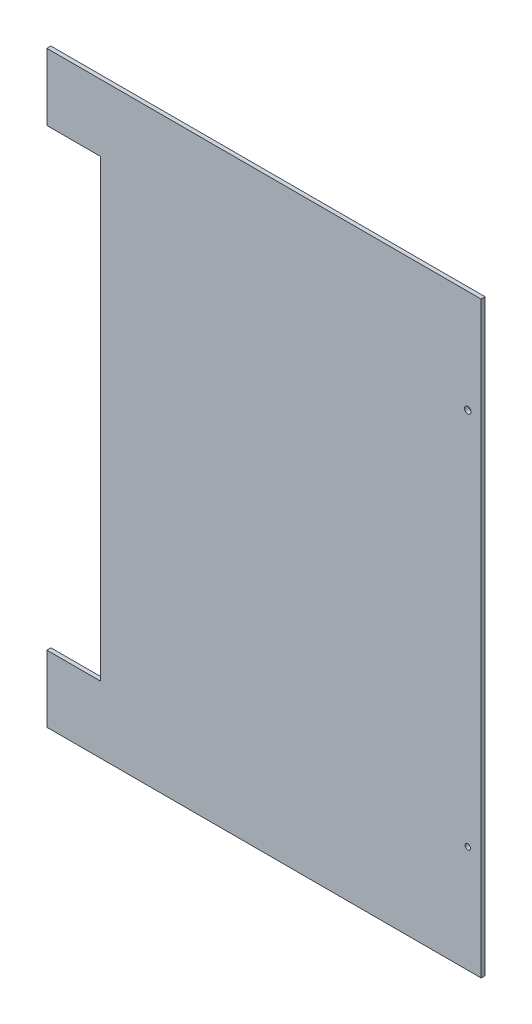
ISO-10303-21;
HEADER;
FILE_DESCRIPTION(('STEP AP214'),'2;1');
FILE_NAME('part.step','',(''),(''),'','','');
FILE_SCHEMA(('AUTOMOTIVE_DESIGN { 1 0 10303 214 1 1 1 1 }'));
ENDSEC;
DATA;
#1=APPLICATION_CONTEXT('core data for automotive mechanical design processes');
#2=APPLICATION_PROTOCOL_DEFINITION('international standard','automotive_design',2000,#1);
#3=PRODUCT_CONTEXT('',#1,'mechanical');
#4=PRODUCT('Part','Part','',(#3));
#5=PRODUCT_RELATED_PRODUCT_CATEGORY('part','',(#4));
#6=PRODUCT_DEFINITION_FORMATION('','',#4);
#7=PRODUCT_DEFINITION_CONTEXT('part definition',#1,'design');
#8=PRODUCT_DEFINITION('design','',#6,#7);
#9=PRODUCT_DEFINITION_SHAPE('','',#8);
#10=(LENGTH_UNIT() NAMED_UNIT(*) SI_UNIT(.MILLI.,.METRE.));
#11=(NAMED_UNIT(*) PLANE_ANGLE_UNIT() SI_UNIT($,.RADIAN.));
#12=(NAMED_UNIT(*) SI_UNIT($,.STERADIAN.) SOLID_ANGLE_UNIT());
#13=UNCERTAINTY_MEASURE_WITH_UNIT(LENGTH_MEASURE(1.E-05),#10,'distance_accuracy_value','');
#14=(GEOMETRIC_REPRESENTATION_CONTEXT(3) GLOBAL_UNCERTAINTY_ASSIGNED_CONTEXT((#13)) GLOBAL_UNIT_ASSIGNED_CONTEXT((#10,
#11,#12)) REPRESENTATION_CONTEXT('',''));
#15=CARTESIAN_POINT('',(0.,0.,0.));
#16=DIRECTION('',(0.,0.,1.));
#17=DIRECTION('',(1.,0.,0.));
#18=AXIS2_PLACEMENT_3D('',#15,#16,#17);
#19=CARTESIAN_POINT('',(-146.5,-1.16176909362561E-13,3.));
#20=DIRECTION('',(-1.,0.,0.));
#21=DIRECTION('',(0.,-1.,0.));
#22=AXIS2_PLACEMENT_3D('',#19,#20,#21);
#23=PLANE('',#22);
#24=DIRECTION('',(0.,0.,1.));
#25=VECTOR('',#24,1.);
#26=CARTESIAN_POINT('',(-146.5,173.326300095906,0.));
#27=LINE('',#26,#25);
#28=CARTESIAN_POINT('',(-146.5,173.326300095906,0.));
#29=VERTEX_POINT('',#28);
#30=CARTESIAN_POINT('',(-146.5,173.326300095906,3.));
#31=VERTEX_POINT('',#30);
#32=EDGE_CURVE('E131',#29,#31,#27,.T.);
#33=ORIENTED_EDGE('',*,*,#32,.T.);
#34=DIRECTION('',(0.,1.,0.));
#35=VECTOR('',#34,1.);
#36=CARTESIAN_POINT('',(-146.5,-1.16176909362561E-13,3.));
#37=LINE('',#36,#35);
#38=CARTESIAN_POINT('',(-146.5,223.326300095906,3.));
#39=VERTEX_POINT('',#38);
#40=EDGE_CURVE('E59',#31,#39,#37,.T.);
#41=ORIENTED_EDGE('',*,*,#40,.T.);
#42=DIRECTION('',(0.,0.,-1.));
#43=VECTOR('',#42,1.);
#44=CARTESIAN_POINT('',(-146.5,223.326300095906,3.));
#45=LINE('',#44,#43);
#46=CARTESIAN_POINT('',(-146.5,223.326300095906,0.));
#47=VERTEX_POINT('',#46);
#48=EDGE_CURVE('E140',#39,#47,#45,.T.);
#49=ORIENTED_EDGE('',*,*,#48,.T.);
#50=DIRECTION('',(0.,1.,0.));
#51=VECTOR('',#50,1.);
#52=CARTESIAN_POINT('',(-146.5,-1.16176909362561E-13,0.));
#53=LINE('',#52,#51);
#54=EDGE_CURVE('E81',#29,#47,#53,.T.);
#55=ORIENTED_EDGE('',*,*,#54,.F.);
#56=EDGE_LOOP('',(#33,#41,#49,#55));
#57=FACE_BOUND('',#56,.T.);
#58=ADVANCED_FACE('F35',(#57),#23,.T.);
#59=DIRECTION('',(0.,0.,1.));
#60=VECTOR('',#59,1.);
#61=CARTESIAN_POINT('',(-146.5,-166.673699904094,0.));
#62=LINE('',#61,#60);
#63=CARTESIAN_POINT('',(-146.5,-166.673699904094,0.));
#64=VERTEX_POINT('',#63);
#65=CARTESIAN_POINT('',(-146.5,-166.673699904094,3.));
#66=VERTEX_POINT('',#65);
#67=EDGE_CURVE('E113',#64,#66,#62,.T.);
#68=ORIENTED_EDGE('',*,*,#67,.F.);
#69=CARTESIAN_POINT('',(-146.5,-216.673699904094,0.));
#70=VERTEX_POINT('',#69);
#71=EDGE_CURVE('E119',#70,#64,#53,.T.);
#72=ORIENTED_EDGE('',*,*,#71,.F.);
#73=DIRECTION('',(0.,0.,-1.));
#74=VECTOR('',#73,1.);
#75=CARTESIAN_POINT('',(-146.5,-216.673699904094,3.));
#76=LINE('',#75,#74);
#77=CARTESIAN_POINT('',(-146.5,-216.673699904094,3.));
#78=VERTEX_POINT('',#77);
#79=EDGE_CURVE('E11',#78,#70,#76,.T.);
#80=ORIENTED_EDGE('',*,*,#79,.F.);
#81=EDGE_CURVE('E121',#78,#66,#37,.T.);
#82=ORIENTED_EDGE('',*,*,#81,.T.);
#83=EDGE_LOOP('',(#68,#72,#80,#82));
#84=FACE_BOUND('',#83,.T.);
#85=ADVANCED_FACE('F37',(#84),#23,.T.);
#86=CARTESIAN_POINT('',(0.,-216.673699904094,3.));
#87=DIRECTION('',(0.,-1.,0.));
#88=DIRECTION('',(1.,0.,0.));
#89=AXIS2_PLACEMENT_3D('',#86,#87,#88);
#90=PLANE('',#89);
#91=DIRECTION('',(-1.,0.,0.));
#92=VECTOR('',#91,1.);
#93=CARTESIAN_POINT('',(0.,-216.673699904094,0.));
#94=LINE('',#93,#92);
#95=CARTESIAN_POINT('',(178.5,-216.673699904094,0.));
#96=VERTEX_POINT('',#95);
#97=EDGE_CURVE('E127',#96,#70,#94,.T.);
#98=ORIENTED_EDGE('',*,*,#97,.F.);
#99=DIRECTION('',(0.,0.,-1.));
#100=VECTOR('',#99,1.);
#101=CARTESIAN_POINT('',(178.5,-216.673699904094,3.));
#102=LINE('',#101,#100);
#103=CARTESIAN_POINT('',(178.5,-216.673699904094,3.));
#104=VERTEX_POINT('',#103);
#105=EDGE_CURVE('E43',#104,#96,#102,.T.);
#106=ORIENTED_EDGE('',*,*,#105,.F.);
#107=DIRECTION('',(-1.,0.,0.));
#108=VECTOR('',#107,1.);
#109=CARTESIAN_POINT('',(0.,-216.673699904094,3.));
#110=LINE('',#109,#108);
#111=EDGE_CURVE('E153',#104,#78,#110,.T.);
#112=ORIENTED_EDGE('',*,*,#111,.T.);
#113=ORIENTED_EDGE('',*,*,#79,.T.);
#114=EDGE_LOOP('',(#98,#106,#112,#113));
#115=FACE_BOUND('',#114,.T.);
#116=ADVANCED_FACE('F152',(#115),#90,.T.);
#117=CARTESIAN_POINT('',(178.5,0.,3.));
#118=DIRECTION('',(-1.,0.,0.));
#119=DIRECTION('',(0.,0.,1.));
#120=AXIS2_PLACEMENT_3D('',#117,#118,#119);
#121=PLANE('',#120);
#122=DIRECTION('',(0.,1.,0.));
#123=VECTOR('',#122,1.);
#124=CARTESIAN_POINT('',(178.5,0.,0.));
#125=LINE('',#124,#123);
#126=CARTESIAN_POINT('',(178.5,223.326300095906,0.));
#127=VERTEX_POINT('',#126);
#128=EDGE_CURVE('E129',#96,#127,#125,.T.);
#129=ORIENTED_EDGE('',*,*,#128,.T.);
#130=DIRECTION('',(0.,0.,-1.));
#131=VECTOR('',#130,1.);
#132=CARTESIAN_POINT('',(178.5,223.326300095906,3.));
#133=LINE('',#132,#131);
#134=CARTESIAN_POINT('',(178.5,223.326300095906,3.));
#135=VERTEX_POINT('',#134);
#136=EDGE_CURVE('E142',#135,#127,#133,.T.);
#137=ORIENTED_EDGE('',*,*,#136,.F.);
#138=DIRECTION('',(0.,1.,0.));
#139=VECTOR('',#138,1.);
#140=CARTESIAN_POINT('',(178.5,0.,3.));
#141=LINE('',#140,#139);
#142=EDGE_CURVE('E148',#104,#135,#141,.T.);
#143=ORIENTED_EDGE('',*,*,#142,.F.);
#144=ORIENTED_EDGE('',*,*,#105,.T.);
#145=EDGE_LOOP('',(#129,#137,#143,#144));
#146=FACE_BOUND('',#145,.T.);
#147=ADVANCED_FACE('F146',(#146),#121,.F.);
#148=CARTESIAN_POINT('',(0.,223.326300095906,3.));
#149=DIRECTION('',(0.,-1.,0.));
#150=DIRECTION('',(1.,0.,0.));
#151=AXIS2_PLACEMENT_3D('',#148,#149,#150);
#152=PLANE('',#151);
#153=DIRECTION('',(-1.,0.,0.));
#154=VECTOR('',#153,1.);
#155=CARTESIAN_POINT('',(0.,223.326300095906,0.));
#156=LINE('',#155,#154);
#157=EDGE_CURVE('E137',#127,#47,#156,.T.);
#158=ORIENTED_EDGE('',*,*,#157,.T.);
#159=ORIENTED_EDGE('',*,*,#48,.F.);
#160=DIRECTION('',(-1.,0.,0.));
#161=VECTOR('',#160,1.);
#162=CARTESIAN_POINT('',(0.,223.326300095906,3.));
#163=LINE('',#162,#161);
#164=EDGE_CURVE('E133',#135,#39,#163,.T.);
#165=ORIENTED_EDGE('',*,*,#164,.F.);
#166=ORIENTED_EDGE('',*,*,#136,.T.);
#167=EDGE_LOOP('',(#158,#159,#165,#166));
#168=FACE_BOUND('',#167,.T.);
#169=ADVANCED_FACE('F220',(#168),#152,.F.);
#170=CARTESIAN_POINT('',(0.,0.,3.));
#171=DIRECTION('',(0.,0.,1.));
#172=DIRECTION('',(1.,0.,0.));
#173=AXIS2_PLACEMENT_3D('',#170,#171,#172);
#174=PLANE('',#173);
#175=CARTESIAN_POINT('',(168.5,-136.673699904094,3.));
#176=DIRECTION('',(0.,0.,-1.));
#177=DIRECTION('',(-1.,0.,0.));
#178=AXIS2_PLACEMENT_3D('',#175,#176,#177);
#179=CIRCLE('',#178,2.);
#180=CARTESIAN_POINT('',(166.5,-136.673699904094,3.));
#181=VERTEX_POINT('',#180);
#182=EDGE_CURVE('E168',#181,#181,#179,.T.);
#183=ORIENTED_EDGE('',*,*,#182,.T.);
#184=EDGE_LOOP('',(#183));
#185=FACE_BOUND('',#184,.T.);
#186=CARTESIAN_POINT('',(168.5,146.326300095906,3.));
#187=DIRECTION('',(0.,0.,-1.));
#188=DIRECTION('',(-1.,0.,0.));
#189=AXIS2_PLACEMENT_3D('',#186,#187,#188);
#190=CIRCLE('',#189,2.41591974317483);
#191=CARTESIAN_POINT('',(166.084080256825,146.326300095906,3.));
#192=VERTEX_POINT('',#191);
#193=EDGE_CURVE('E174',#192,#192,#190,.T.);
#194=ORIENTED_EDGE('',*,*,#193,.T.);
#195=EDGE_LOOP('',(#194));
#196=FACE_BOUND('',#195,.T.);
#197=DIRECTION('',(-1.,0.,0.));
#198=VECTOR('',#197,1.);
#199=CARTESIAN_POINT('',(-146.5,173.326300095906,3.));
#200=LINE('',#199,#198);
#201=CARTESIAN_POINT('',(-106.5,173.326300095906,3.));
#202=VERTEX_POINT('',#201);
#203=EDGE_CURVE('E117',#202,#31,#200,.T.);
#204=ORIENTED_EDGE('',*,*,#203,.F.);
#205=DIRECTION('',(0.,1.,0.));
#206=VECTOR('',#205,1.);
#207=CARTESIAN_POINT('',(-106.5,173.326300095906,3.));
#208=LINE('',#207,#206);
#209=CARTESIAN_POINT('',(-106.5,-166.673699904094,3.));
#210=VERTEX_POINT('',#209);
#211=EDGE_CURVE('E163',#210,#202,#208,.T.);
#212=ORIENTED_EDGE('',*,*,#211,.F.);
#213=DIRECTION('',(1.,0.,0.));
#214=VECTOR('',#213,1.);
#215=CARTESIAN_POINT('',(-146.5,-166.673699904094,3.));
#216=LINE('',#215,#214);
#217=EDGE_CURVE('E166',#66,#210,#216,.T.);
#218=ORIENTED_EDGE('',*,*,#217,.F.);
#219=ORIENTED_EDGE('',*,*,#81,.F.);
#220=ORIENTED_EDGE('',*,*,#111,.F.);
#221=ORIENTED_EDGE('',*,*,#142,.T.);
#222=ORIENTED_EDGE('',*,*,#164,.T.);
#223=ORIENTED_EDGE('',*,*,#40,.F.);
#224=EDGE_LOOP('',(#204,#212,#218,#219,#220,#221,#222,#223));
#225=FACE_BOUND('',#224,.T.);
#226=ADVANCED_FACE('F183',(#185,#196,#225),#174,.T.);
#227=CARTESIAN_POINT('',(0.,0.,0.));
#228=DIRECTION('',(0.,0.,1.));
#229=DIRECTION('',(1.,0.,0.));
#230=AXIS2_PLACEMENT_3D('',#227,#228,#229);
#231=PLANE('',#230);
#232=CARTESIAN_POINT('',(168.5,-136.673699904094,0.));
#233=DIRECTION('',(0.,0.,-1.));
#234=DIRECTION('',(-1.,0.,0.));
#235=AXIS2_PLACEMENT_3D('',#232,#233,#234);
#236=CIRCLE('',#235,2.);
#237=CARTESIAN_POINT('',(166.5,-136.673699904094,0.));
#238=VERTEX_POINT('',#237);
#239=EDGE_CURVE('E177',#238,#238,#236,.T.);
#240=ORIENTED_EDGE('',*,*,#239,.F.);
#241=EDGE_LOOP('',(#240));
#242=FACE_BOUND('',#241,.T.);
#243=CARTESIAN_POINT('',(168.5,146.326300095906,0.));
#244=DIRECTION('',(0.,0.,-1.));
#245=DIRECTION('',(-1.,0.,0.));
#246=AXIS2_PLACEMENT_3D('',#243,#244,#245);
#247=CIRCLE('',#246,2.41591974317483);
#248=CARTESIAN_POINT('',(166.084080256825,146.326300095906,0.));
#249=VERTEX_POINT('',#248);
#250=EDGE_CURVE('E171',#249,#249,#247,.T.);
#251=ORIENTED_EDGE('',*,*,#250,.F.);
#252=EDGE_LOOP('',(#251));
#253=FACE_BOUND('',#252,.T.);
#254=DIRECTION('',(0.,1.,0.));
#255=VECTOR('',#254,1.);
#256=CARTESIAN_POINT('',(-106.5,173.326300095906,0.));
#257=LINE('',#256,#255);
#258=CARTESIAN_POINT('',(-106.5,-166.673699904094,0.));
#259=VERTEX_POINT('',#258);
#260=CARTESIAN_POINT('',(-106.5,173.326300095906,0.));
#261=VERTEX_POINT('',#260);
#262=EDGE_CURVE('E50',#259,#261,#257,.T.);
#263=ORIENTED_EDGE('',*,*,#262,.T.);
#264=DIRECTION('',(-1.,0.,0.));
#265=VECTOR('',#264,1.);
#266=CARTESIAN_POINT('',(-146.5,173.326300095906,0.));
#267=LINE('',#266,#265);
#268=EDGE_CURVE('E122',#261,#29,#267,.T.);
#269=ORIENTED_EDGE('',*,*,#268,.T.);
#270=ORIENTED_EDGE('',*,*,#54,.T.);
#271=ORIENTED_EDGE('',*,*,#157,.F.);
#272=ORIENTED_EDGE('',*,*,#128,.F.);
#273=ORIENTED_EDGE('',*,*,#97,.T.);
#274=ORIENTED_EDGE('',*,*,#71,.T.);
#275=DIRECTION('',(1.,0.,0.));
#276=VECTOR('',#275,1.);
#277=CARTESIAN_POINT('',(-146.5,-166.673699904094,0.));
#278=LINE('',#277,#276);
#279=EDGE_CURVE('E109',#64,#259,#278,.T.);
#280=ORIENTED_EDGE('',*,*,#279,.T.);
#281=EDGE_LOOP('',(#263,#269,#270,#271,#272,#273,#274,#280));
#282=FACE_BOUND('',#281,.T.);
#283=ADVANCED_FACE('F124',(#242,#253,#282),#231,.F.);
#284=CARTESIAN_POINT('',(-146.5,173.326300095906,0.));
#285=DIRECTION('',(0.,1.,0.));
#286=DIRECTION('',(-1.,0.,0.));
#287=AXIS2_PLACEMENT_3D('',#284,#285,#286);
#288=PLANE('',#287);
#289=ORIENTED_EDGE('',*,*,#203,.T.);
#290=ORIENTED_EDGE('',*,*,#32,.F.);
#291=ORIENTED_EDGE('',*,*,#268,.F.);
#292=DIRECTION('',(0.,0.,1.));
#293=VECTOR('',#292,1.);
#294=CARTESIAN_POINT('',(-106.5,173.326300095906,0.));
#295=LINE('',#294,#293);
#296=EDGE_CURVE('E159',#261,#202,#295,.T.);
#297=ORIENTED_EDGE('',*,*,#296,.T.);
#298=EDGE_LOOP('',(#289,#290,#291,#297));
#299=FACE_BOUND('',#298,.T.);
#300=ADVANCED_FACE('F195',(#299),#288,.F.);
#301=CARTESIAN_POINT('',(-106.5,173.326300095906,0.));
#302=DIRECTION('',(1.,0.,0.));
#303=DIRECTION('',(0.,1.,0.));
#304=AXIS2_PLACEMENT_3D('',#301,#302,#303);
#305=PLANE('',#304);
#306=ORIENTED_EDGE('',*,*,#211,.T.);
#307=ORIENTED_EDGE('',*,*,#296,.F.);
#308=ORIENTED_EDGE('',*,*,#262,.F.);
#309=DIRECTION('',(0.,0.,1.));
#310=VECTOR('',#309,1.);
#311=CARTESIAN_POINT('',(-106.5,-166.673699904094,0.));
#312=LINE('',#311,#310);
#313=EDGE_CURVE('E115',#259,#210,#312,.T.);
#314=ORIENTED_EDGE('',*,*,#313,.T.);
#315=EDGE_LOOP('',(#306,#307,#308,#314));
#316=FACE_BOUND('',#315,.T.);
#317=ADVANCED_FACE('F205',(#316),#305,.F.);
#318=CARTESIAN_POINT('',(-146.5,-166.673699904094,0.));
#319=DIRECTION('',(0.,-1.,0.));
#320=DIRECTION('',(1.,0.,0.));
#321=AXIS2_PLACEMENT_3D('',#318,#319,#320);
#322=PLANE('',#321);
#323=ORIENTED_EDGE('',*,*,#217,.T.);
#324=ORIENTED_EDGE('',*,*,#313,.F.);
#325=ORIENTED_EDGE('',*,*,#279,.F.);
#326=ORIENTED_EDGE('',*,*,#67,.T.);
#327=EDGE_LOOP('',(#323,#324,#325,#326));
#328=FACE_BOUND('',#327,.T.);
#329=ADVANCED_FACE('F112',(#328),#322,.F.);
#330=CARTESIAN_POINT('',(168.5,146.326300095906,3.));
#331=DIRECTION('',(0.,0.,-1.));
#332=DIRECTION('',(-1.,0.,0.));
#333=AXIS2_PLACEMENT_3D('',#330,#331,#332);
#334=CYLINDRICAL_SURFACE('',#333,2.41591974317483);
#335=ORIENTED_EDGE('',*,*,#193,.F.);
#336=EDGE_LOOP('',(#335));
#337=FACE_BOUND('',#336,.T.);
#338=ORIENTED_EDGE('',*,*,#250,.T.);
#339=EDGE_LOOP('',(#338));
#340=FACE_BOUND('',#339,.T.);
#341=ADVANCED_FACE('F189',(#337,#340),#334,.F.);
#342=CARTESIAN_POINT('',(168.5,-136.673699904094,3.));
#343=DIRECTION('',(0.,0.,-1.));
#344=DIRECTION('',(-1.,0.,0.));
#345=AXIS2_PLACEMENT_3D('',#342,#343,#344);
#346=CYLINDRICAL_SURFACE('',#345,2.);
#347=ORIENTED_EDGE('',*,*,#182,.F.);
#348=EDGE_LOOP('',(#347));
#349=FACE_BOUND('',#348,.T.);
#350=ORIENTED_EDGE('',*,*,#239,.T.);
#351=EDGE_LOOP('',(#350));
#352=FACE_BOUND('',#351,.T.);
#353=ADVANCED_FACE('F186',(#349,#352),#346,.F.);
#354=CLOSED_SHELL('',(#58,#85,#116,#147,#169,#226,#283,#300,#317,#329,#341,#353));
#355=MANIFOLD_SOLID_BREP('B2',#354);
#356=ADVANCED_BREP_SHAPE_REPRESENTATION('',(#18,#355),#14);
#357=SHAPE_DEFINITION_REPRESENTATION(#9,#356);
ENDSEC;
END-ISO-10303-21;
